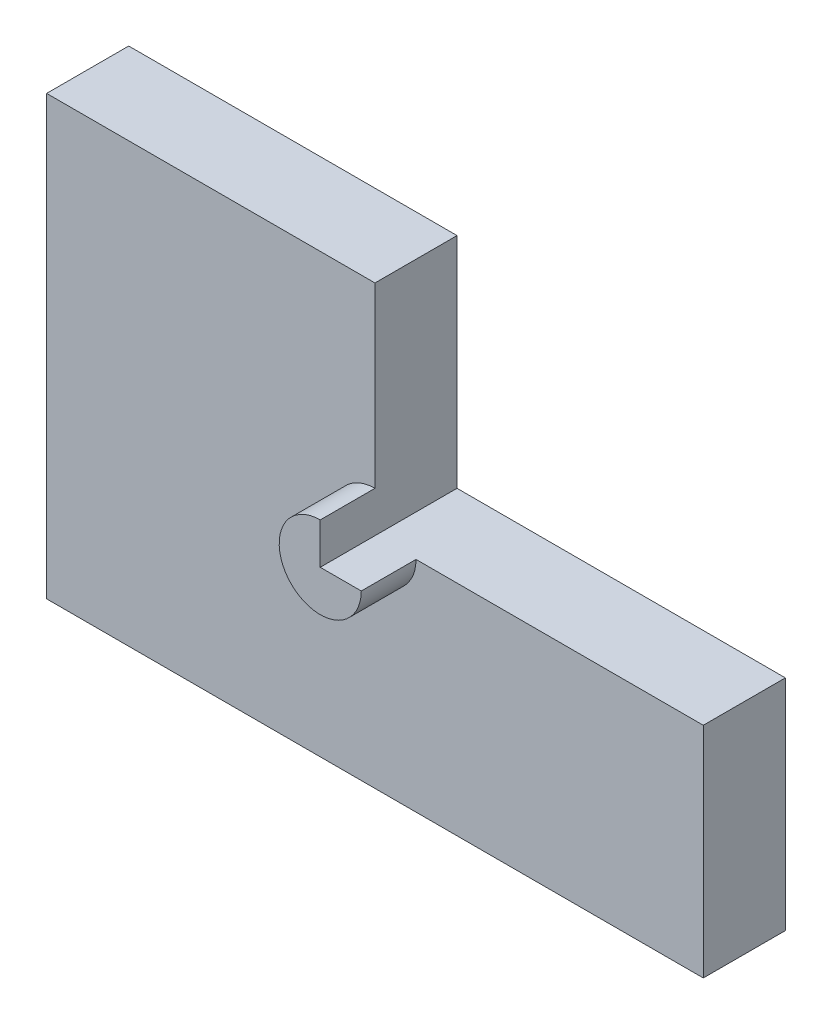
ISO-10303-21;
HEADER;
FILE_DESCRIPTION(('STEP AP214'),'2;1');
FILE_NAME('part.step','',(''),(''),'','','');
FILE_SCHEMA(('AUTOMOTIVE_DESIGN { 1 0 10303 214 1 1 1 1 }'));
ENDSEC;
DATA;
#1=APPLICATION_CONTEXT('core data for automotive mechanical design processes');
#2=APPLICATION_PROTOCOL_DEFINITION('international standard','automotive_design',2000,#1);
#3=PRODUCT_CONTEXT('',#1,'mechanical');
#4=PRODUCT('Part','Part','',(#3));
#5=PRODUCT_RELATED_PRODUCT_CATEGORY('part','',(#4));
#6=PRODUCT_DEFINITION_FORMATION('','',#4);
#7=PRODUCT_DEFINITION_CONTEXT('part definition',#1,'design');
#8=PRODUCT_DEFINITION('design','',#6,#7);
#9=PRODUCT_DEFINITION_SHAPE('','',#8);
#10=(LENGTH_UNIT() NAMED_UNIT(*) SI_UNIT(.MILLI.,.METRE.));
#11=(NAMED_UNIT(*) PLANE_ANGLE_UNIT() SI_UNIT($,.RADIAN.));
#12=(NAMED_UNIT(*) SI_UNIT($,.STERADIAN.) SOLID_ANGLE_UNIT());
#13=UNCERTAINTY_MEASURE_WITH_UNIT(LENGTH_MEASURE(1.E-05),#10,'distance_accuracy_value','');
#14=(GEOMETRIC_REPRESENTATION_CONTEXT(3) GLOBAL_UNCERTAINTY_ASSIGNED_CONTEXT((#13)) GLOBAL_UNIT_ASSIGNED_CONTEXT((#10,
#11,#12)) REPRESENTATION_CONTEXT('',''));
#15=CARTESIAN_POINT('',(0.,0.,0.));
#16=DIRECTION('',(0.,0.,1.));
#17=DIRECTION('',(1.,0.,0.));
#18=AXIS2_PLACEMENT_3D('',#15,#16,#17);
#19=CARTESIAN_POINT('',(152.4,101.6,19.05));
#20=DIRECTION('',(-1.,0.,0.));
#21=DIRECTION('',(0.,-1.,0.));
#22=AXIS2_PLACEMENT_3D('',#19,#20,#21);
#23=PLANE('',#22);
#24=DIRECTION('',(0.,0.,1.));
#25=VECTOR('',#24,1.);
#26=CARTESIAN_POINT('',(152.4,50.8,0.));
#27=LINE('',#26,#25);
#28=CARTESIAN_POINT('',(152.4,50.8,0.));
#29=VERTEX_POINT('',#28);
#30=CARTESIAN_POINT('',(152.4,50.8,19.05));
#31=VERTEX_POINT('',#30);
#32=EDGE_CURVE('E137',#29,#31,#27,.T.);
#33=ORIENTED_EDGE('',*,*,#32,.T.);
#34=DIRECTION('',(0.,1.,0.));
#35=VECTOR('',#34,1.);
#36=CARTESIAN_POINT('',(152.4,101.6,19.05));
#37=LINE('',#36,#35);
#38=CARTESIAN_POINT('',(152.4,0.,19.05));
#39=VERTEX_POINT('',#38);
#40=EDGE_CURVE('E152',#39,#31,#37,.T.);
#41=ORIENTED_EDGE('',*,*,#40,.F.);
#42=DIRECTION('',(0.,0.,-1.));
#43=VECTOR('',#42,1.);
#44=CARTESIAN_POINT('',(152.4,0.,19.05));
#45=LINE('',#44,#43);
#46=CARTESIAN_POINT('',(152.4,0.,0.));
#47=VERTEX_POINT('',#46);
#48=EDGE_CURVE('E51',#39,#47,#45,.T.);
#49=ORIENTED_EDGE('',*,*,#48,.T.);
#50=DIRECTION('',(0.,1.,0.));
#51=VECTOR('',#50,1.);
#52=CARTESIAN_POINT('',(152.4,101.6,0.));
#53=LINE('',#52,#51);
#54=EDGE_CURVE('E162',#47,#29,#53,.T.);
#55=ORIENTED_EDGE('',*,*,#54,.T.);
#56=EDGE_LOOP('',(#33,#41,#49,#55));
#57=FACE_BOUND('',#56,.T.);
#58=ADVANCED_FACE('F43',(#57),#23,.F.);
#59=CARTESIAN_POINT('',(0.,0.,19.05));
#60=DIRECTION('',(0.,0.,1.));
#61=DIRECTION('',(1.,0.,0.));
#62=AXIS2_PLACEMENT_3D('',#59,#60,#61);
#63=PLANE('',#62);
#64=CARTESIAN_POINT('',(76.2,50.8,19.05));
#65=DIRECTION('',(0.,0.,1.));
#66=DIRECTION('',(1.,0.,0.));
#67=AXIS2_PLACEMENT_3D('',#64,#65,#66);
#68=CIRCLE('',#67,9.52500000000001);
#69=CARTESIAN_POINT('',(76.2,60.325,19.05));
#70=VERTEX_POINT('',#69);
#71=CARTESIAN_POINT('',(85.725,50.8,19.05));
#72=VERTEX_POINT('',#71);
#73=EDGE_CURVE('E58',#70,#72,#68,.T.);
#74=ORIENTED_EDGE('',*,*,#73,.F.);
#75=DIRECTION('',(0.,-1.,0.));
#76=VECTOR('',#75,1.);
#77=CARTESIAN_POINT('',(76.2,0.,19.05));
#78=LINE('',#77,#76);
#79=CARTESIAN_POINT('',(76.2,101.6,19.05));
#80=VERTEX_POINT('',#79);
#81=EDGE_CURVE('E112',#80,#70,#78,.T.);
#82=ORIENTED_EDGE('',*,*,#81,.F.);
#83=DIRECTION('',(-1.,0.,0.));
#84=VECTOR('',#83,1.);
#85=CARTESIAN_POINT('',(0.,101.6,19.05));
#86=LINE('',#85,#84);
#87=CARTESIAN_POINT('',(0.,101.6,19.05));
#88=VERTEX_POINT('',#87);
#89=EDGE_CURVE('E155',#80,#88,#86,.T.);
#90=ORIENTED_EDGE('',*,*,#89,.T.);
#91=DIRECTION('',(0.,-1.,0.));
#92=VECTOR('',#91,1.);
#93=CARTESIAN_POINT('',(0.,101.6,19.05));
#94=LINE('',#93,#92);
#95=CARTESIAN_POINT('',(0.,0.,19.05));
#96=VERTEX_POINT('',#95);
#97=EDGE_CURVE('E146',#88,#96,#94,.T.);
#98=ORIENTED_EDGE('',*,*,#97,.T.);
#99=DIRECTION('',(1.,0.,0.));
#100=VECTOR('',#99,1.);
#101=CARTESIAN_POINT('',(0.,0.,19.05));
#102=LINE('',#101,#100);
#103=EDGE_CURVE('E149',#96,#39,#102,.T.);
#104=ORIENTED_EDGE('',*,*,#103,.T.);
#105=ORIENTED_EDGE('',*,*,#40,.T.);
#106=DIRECTION('',(-1.,0.,0.));
#107=VECTOR('',#106,1.);
#108=CARTESIAN_POINT('',(0.,50.8,19.05));
#109=LINE('',#108,#107);
#110=EDGE_CURVE('E114',#31,#72,#109,.T.);
#111=ORIENTED_EDGE('',*,*,#110,.T.);
#112=EDGE_LOOP('',(#74,#82,#90,#98,#104,#105,#111));
#113=FACE_BOUND('',#112,.T.);
#114=ADVANCED_FACE('F180',(#113),#63,.T.);
#115=CARTESIAN_POINT('',(0.,0.,0.));
#116=DIRECTION('',(0.,0.,1.));
#117=DIRECTION('',(1.,0.,0.));
#118=AXIS2_PLACEMENT_3D('',#115,#116,#117);
#119=PLANE('',#118);
#120=DIRECTION('',(-1.,0.,0.));
#121=VECTOR('',#120,1.);
#122=CARTESIAN_POINT('',(0.,50.8,0.));
#123=LINE('',#122,#121);
#124=CARTESIAN_POINT('',(76.2,50.8,0.));
#125=VERTEX_POINT('',#124);
#126=EDGE_CURVE('E132',#29,#125,#123,.T.);
#127=ORIENTED_EDGE('',*,*,#126,.F.);
#128=ORIENTED_EDGE('',*,*,#54,.F.);
#129=DIRECTION('',(1.,0.,0.));
#130=VECTOR('',#129,1.);
#131=CARTESIAN_POINT('',(0.,0.,0.));
#132=LINE('',#131,#130);
#133=CARTESIAN_POINT('',(0.,0.,0.));
#134=VERTEX_POINT('',#133);
#135=EDGE_CURVE('E160',#134,#47,#132,.T.);
#136=ORIENTED_EDGE('',*,*,#135,.F.);
#137=DIRECTION('',(0.,-1.,0.));
#138=VECTOR('',#137,1.);
#139=CARTESIAN_POINT('',(0.,101.6,0.));
#140=LINE('',#139,#138);
#141=CARTESIAN_POINT('',(0.,101.6,0.));
#142=VERTEX_POINT('',#141);
#143=EDGE_CURVE('E141',#142,#134,#140,.T.);
#144=ORIENTED_EDGE('',*,*,#143,.F.);
#145=DIRECTION('',(-1.,0.,0.));
#146=VECTOR('',#145,1.);
#147=CARTESIAN_POINT('',(0.,101.6,0.));
#148=LINE('',#147,#146);
#149=CARTESIAN_POINT('',(76.2,101.6,0.));
#150=VERTEX_POINT('',#149);
#151=EDGE_CURVE('E150',#150,#142,#148,.T.);
#152=ORIENTED_EDGE('',*,*,#151,.F.);
#153=DIRECTION('',(0.,-1.,0.));
#154=VECTOR('',#153,1.);
#155=CARTESIAN_POINT('',(76.2,0.,0.));
#156=LINE('',#155,#154);
#157=EDGE_CURVE('E134',#150,#125,#156,.T.);
#158=ORIENTED_EDGE('',*,*,#157,.T.);
#159=EDGE_LOOP('',(#127,#128,#136,#144,#152,#158));
#160=FACE_BOUND('',#159,.T.);
#161=ADVANCED_FACE('F175',(#160),#119,.F.);
#162=CARTESIAN_POINT('',(0.,101.6,19.05));
#163=DIRECTION('',(1.,0.,0.));
#164=DIRECTION('',(0.,0.,-1.));
#165=AXIS2_PLACEMENT_3D('',#162,#163,#164);
#166=PLANE('',#165);
#167=ORIENTED_EDGE('',*,*,#143,.T.);
#168=DIRECTION('',(0.,0.,-1.));
#169=VECTOR('',#168,1.);
#170=CARTESIAN_POINT('',(0.,0.,19.05));
#171=LINE('',#170,#169);
#172=EDGE_CURVE('E11',#96,#134,#171,.T.);
#173=ORIENTED_EDGE('',*,*,#172,.F.);
#174=ORIENTED_EDGE('',*,*,#97,.F.);
#175=DIRECTION('',(0.,0.,-1.));
#176=VECTOR('',#175,1.);
#177=CARTESIAN_POINT('',(0.,101.6,19.05));
#178=LINE('',#177,#176);
#179=EDGE_CURVE('E157',#88,#142,#178,.T.);
#180=ORIENTED_EDGE('',*,*,#179,.T.);
#181=EDGE_LOOP('',(#167,#173,#174,#180));
#182=FACE_BOUND('',#181,.T.);
#183=ADVANCED_FACE('F45',(#182),#166,.F.);
#184=CARTESIAN_POINT('',(0.,0.,19.05));
#185=DIRECTION('',(0.,1.,0.));
#186=DIRECTION('',(0.,0.,1.));
#187=AXIS2_PLACEMENT_3D('',#184,#185,#186);
#188=PLANE('',#187);
#189=ORIENTED_EDGE('',*,*,#135,.T.);
#190=ORIENTED_EDGE('',*,*,#48,.F.);
#191=ORIENTED_EDGE('',*,*,#103,.F.);
#192=ORIENTED_EDGE('',*,*,#172,.T.);
#193=EDGE_LOOP('',(#189,#190,#191,#192));
#194=FACE_BOUND('',#193,.T.);
#195=ADVANCED_FACE('F183',(#194),#188,.F.);
#196=CARTESIAN_POINT('',(0.,101.6,19.05));
#197=DIRECTION('',(0.,-1.,0.));
#198=DIRECTION('',(0.,0.,-1.));
#199=AXIS2_PLACEMENT_3D('',#196,#197,#198);
#200=PLANE('',#199);
#201=ORIENTED_EDGE('',*,*,#89,.F.);
#202=DIRECTION('',(0.,0.,1.));
#203=VECTOR('',#202,1.);
#204=CARTESIAN_POINT('',(76.2,101.6,0.));
#205=LINE('',#204,#203);
#206=EDGE_CURVE('E142',#150,#80,#205,.T.);
#207=ORIENTED_EDGE('',*,*,#206,.F.);
#208=ORIENTED_EDGE('',*,*,#151,.T.);
#209=ORIENTED_EDGE('',*,*,#179,.F.);
#210=EDGE_LOOP('',(#201,#207,#208,#209));
#211=FACE_BOUND('',#210,.T.);
#212=ADVANCED_FACE('F189',(#211),#200,.F.);
#213=CARTESIAN_POINT('',(0.,50.8,0.));
#214=DIRECTION('',(0.,1.,0.));
#215=DIRECTION('',(-1.,0.,0.));
#216=AXIS2_PLACEMENT_3D('',#213,#214,#215);
#217=PLANE('',#216);
#218=ORIENTED_EDGE('',*,*,#110,.F.);
#219=ORIENTED_EDGE('',*,*,#32,.F.);
#220=ORIENTED_EDGE('',*,*,#126,.T.);
#221=DIRECTION('',(0.,0.,1.));
#222=VECTOR('',#221,1.);
#223=CARTESIAN_POINT('',(76.2,50.8,0.));
#224=LINE('',#223,#222);
#225=CARTESIAN_POINT('',(76.2,50.8,31.75));
#226=VERTEX_POINT('',#225);
#227=EDGE_CURVE('E66',#125,#226,#224,.T.);
#228=ORIENTED_EDGE('',*,*,#227,.T.);
#229=DIRECTION('',(-1.,0.,0.));
#230=VECTOR('',#229,1.);
#231=CARTESIAN_POINT('',(0.,50.8,31.75));
#232=LINE('',#231,#230);
#233=CARTESIAN_POINT('',(85.725,50.8,31.75));
#234=VERTEX_POINT('',#233);
#235=EDGE_CURVE('E124',#234,#226,#232,.T.);
#236=ORIENTED_EDGE('',*,*,#235,.F.);
#237=DIRECTION('',(0.,0.,-1.));
#238=VECTOR('',#237,1.);
#239=CARTESIAN_POINT('',(85.725,50.8,31.75));
#240=LINE('',#239,#238);
#241=EDGE_CURVE('E115',#234,#72,#240,.T.);
#242=ORIENTED_EDGE('',*,*,#241,.T.);
#243=EDGE_LOOP('',(#218,#219,#220,#228,#236,#242));
#244=FACE_BOUND('',#243,.T.);
#245=ADVANCED_FACE('F179',(#244),#217,.T.);
#246=CARTESIAN_POINT('',(76.2,0.,0.));
#247=DIRECTION('',(-1.,0.,0.));
#248=DIRECTION('',(0.,0.,1.));
#249=AXIS2_PLACEMENT_3D('',#246,#247,#248);
#250=PLANE('',#249);
#251=ORIENTED_EDGE('',*,*,#81,.T.);
#252=DIRECTION('',(0.,0.,-1.));
#253=VECTOR('',#252,1.);
#254=CARTESIAN_POINT('',(76.2,60.325,31.75));
#255=LINE('',#254,#253);
#256=CARTESIAN_POINT('',(76.2,60.325,31.75));
#257=VERTEX_POINT('',#256);
#258=EDGE_CURVE('E107',#257,#70,#255,.T.);
#259=ORIENTED_EDGE('',*,*,#258,.F.);
#260=DIRECTION('',(0.,-1.,0.));
#261=VECTOR('',#260,1.);
#262=CARTESIAN_POINT('',(76.2,0.,31.75));
#263=LINE('',#262,#261);
#264=EDGE_CURVE('E111',#257,#226,#263,.T.);
#265=ORIENTED_EDGE('',*,*,#264,.T.);
#266=ORIENTED_EDGE('',*,*,#227,.F.);
#267=ORIENTED_EDGE('',*,*,#157,.F.);
#268=ORIENTED_EDGE('',*,*,#206,.T.);
#269=EDGE_LOOP('',(#251,#259,#265,#266,#267,#268));
#270=FACE_BOUND('',#269,.T.);
#271=ADVANCED_FACE('F109',(#270),#250,.F.);
#272=CARTESIAN_POINT('',(76.2,50.8,31.75));
#273=DIRECTION('',(0.,0.,-1.));
#274=DIRECTION('',(-1.,0.,0.));
#275=AXIS2_PLACEMENT_3D('',#272,#273,#274);
#276=CYLINDRICAL_SURFACE('',#275,9.52500000000001);
#277=ORIENTED_EDGE('',*,*,#73,.T.);
#278=ORIENTED_EDGE('',*,*,#241,.F.);
#279=CARTESIAN_POINT('',(76.2,50.8,31.75));
#280=DIRECTION('',(0.,0.,1.));
#281=DIRECTION('',(1.,0.,0.));
#282=AXIS2_PLACEMENT_3D('',#279,#280,#281);
#283=CIRCLE('',#282,9.52500000000001);
#284=EDGE_CURVE('E118',#257,#234,#283,.T.);
#285=ORIENTED_EDGE('',*,*,#284,.F.);
#286=ORIENTED_EDGE('',*,*,#258,.T.);
#287=EDGE_LOOP('',(#277,#278,#285,#286));
#288=FACE_BOUND('',#287,.T.);
#289=ADVANCED_FACE('F119',(#288),#276,.T.);
#290=CARTESIAN_POINT('',(0.,0.,31.75));
#291=DIRECTION('',(0.,0.,1.));
#292=DIRECTION('',(1.,0.,0.));
#293=AXIS2_PLACEMENT_3D('',#290,#291,#292);
#294=PLANE('',#293);
#295=ORIENTED_EDGE('',*,*,#264,.F.);
#296=ORIENTED_EDGE('',*,*,#284,.T.);
#297=ORIENTED_EDGE('',*,*,#235,.T.);
#298=EDGE_LOOP('',(#295,#296,#297));
#299=FACE_BOUND('',#298,.T.);
#300=ADVANCED_FACE('F126',(#299),#294,.T.);
#301=CLOSED_SHELL('',(#58,#114,#161,#183,#195,#212,#245,#271,#289,#300));
#302=MANIFOLD_SOLID_BREP('B2',#301);
#303=ADVANCED_BREP_SHAPE_REPRESENTATION('',(#18,#302),#14);
#304=SHAPE_DEFINITION_REPRESENTATION(#9,#303);
ENDSEC;
END-ISO-10303-21;
